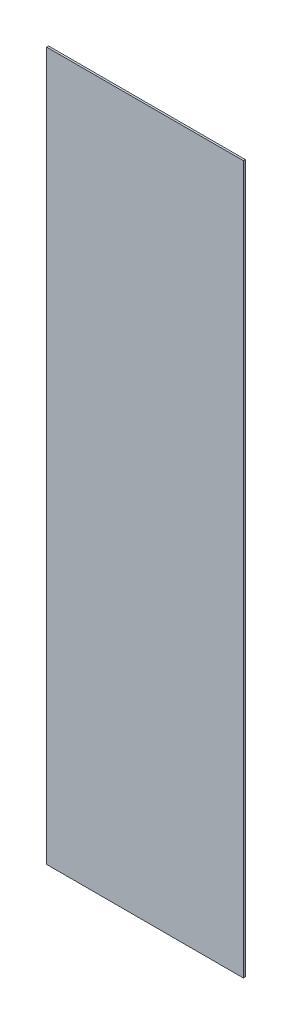
ISO-10303-21;
HEADER;
FILE_DESCRIPTION(('STEP AP214'),'2;1');
FILE_NAME('part.step','',(''),(''),'','','');
FILE_SCHEMA(('AUTOMOTIVE_DESIGN { 1 0 10303 214 1 1 1 1 }'));
ENDSEC;
DATA;
#1=APPLICATION_CONTEXT('core data for automotive mechanical design processes');
#2=APPLICATION_PROTOCOL_DEFINITION('international standard','automotive_design',2000,#1);
#3=PRODUCT_CONTEXT('',#1,'mechanical');
#4=PRODUCT('Part','Part','',(#3));
#5=PRODUCT_RELATED_PRODUCT_CATEGORY('part','',(#4));
#6=PRODUCT_DEFINITION_FORMATION('','',#4);
#7=PRODUCT_DEFINITION_CONTEXT('part definition',#1,'design');
#8=PRODUCT_DEFINITION('design','',#6,#7);
#9=PRODUCT_DEFINITION_SHAPE('','',#8);
#10=(LENGTH_UNIT() NAMED_UNIT(*) SI_UNIT(.MILLI.,.METRE.));
#11=(NAMED_UNIT(*) PLANE_ANGLE_UNIT() SI_UNIT($,.RADIAN.));
#12=(NAMED_UNIT(*) SI_UNIT($,.STERADIAN.) SOLID_ANGLE_UNIT());
#13=UNCERTAINTY_MEASURE_WITH_UNIT(LENGTH_MEASURE(1.E-05),#10,'distance_accuracy_value','');
#14=(GEOMETRIC_REPRESENTATION_CONTEXT(3) GLOBAL_UNCERTAINTY_ASSIGNED_CONTEXT((#13)) GLOBAL_UNIT_ASSIGNED_CONTEXT((#10,
#11,#12)) REPRESENTATION_CONTEXT('',''));
#15=CARTESIAN_POINT('',(0.,0.,0.));
#16=DIRECTION('',(0.,0.,1.));
#17=DIRECTION('',(1.,0.,0.));
#18=AXIS2_PLACEMENT_3D('',#15,#16,#17);
#19=CARTESIAN_POINT('',(0.,0.,2.54));
#20=DIRECTION('',(1.,0.,0.));
#21=DIRECTION('',(0.,0.,-1.));
#22=AXIS2_PLACEMENT_3D('',#19,#20,#21);
#23=PLANE('',#22);
#24=DIRECTION('',(0.,-1.,0.));
#25=VECTOR('',#24,1.);
#26=CARTESIAN_POINT('',(0.,0.,0.));
#27=LINE('',#26,#25);
#28=CARTESIAN_POINT('',(0.,914.4,0.));
#29=VERTEX_POINT('',#28);
#30=CARTESIAN_POINT('',(0.,0.,0.));
#31=VERTEX_POINT('',#30);
#32=EDGE_CURVE('E96',#29,#31,#27,.T.);
#33=ORIENTED_EDGE('',*,*,#32,.T.);
#34=DIRECTION('',(0.,0.,-1.));
#35=VECTOR('',#34,1.);
#36=CARTESIAN_POINT('',(0.,0.,2.54));
#37=LINE('',#36,#35);
#38=CARTESIAN_POINT('',(0.,0.,2.54));
#39=VERTEX_POINT('',#38);
#40=EDGE_CURVE('E11',#39,#31,#37,.T.);
#41=ORIENTED_EDGE('',*,*,#40,.F.);
#42=DIRECTION('',(0.,-1.,0.));
#43=VECTOR('',#42,1.);
#44=CARTESIAN_POINT('',(0.,0.,2.54));
#45=LINE('',#44,#43);
#46=CARTESIAN_POINT('',(0.,914.4,2.54));
#47=VERTEX_POINT('',#46);
#48=EDGE_CURVE('E84',#47,#39,#45,.T.);
#49=ORIENTED_EDGE('',*,*,#48,.F.);
#50=DIRECTION('',(0.,0.,-1.));
#51=VECTOR('',#50,1.);
#52=CARTESIAN_POINT('',(0.,914.4,2.54));
#53=LINE('',#52,#51);
#54=EDGE_CURVE('E92',#47,#29,#53,.T.);
#55=ORIENTED_EDGE('',*,*,#54,.T.);
#56=EDGE_LOOP('',(#33,#41,#49,#55));
#57=FACE_BOUND('',#56,.T.);
#58=ADVANCED_FACE('F33',(#57),#23,.F.);
#59=CARTESIAN_POINT('',(0.,0.,2.54));
#60=DIRECTION('',(0.,1.,0.));
#61=DIRECTION('',(0.,0.,1.));
#62=AXIS2_PLACEMENT_3D('',#59,#60,#61);
#63=PLANE('',#62);
#64=DIRECTION('',(1.,0.,0.));
#65=VECTOR('',#64,1.);
#66=CARTESIAN_POINT('',(0.,0.,0.));
#67=LINE('',#66,#65);
#68=CARTESIAN_POINT('',(254.,0.,0.));
#69=VERTEX_POINT('',#68);
#70=EDGE_CURVE('E88',#31,#69,#67,.T.);
#71=ORIENTED_EDGE('',*,*,#70,.T.);
#72=DIRECTION('',(0.,0.,-1.));
#73=VECTOR('',#72,1.);
#74=CARTESIAN_POINT('',(254.,0.,2.54));
#75=LINE('',#74,#73);
#76=CARTESIAN_POINT('',(254.,0.,2.54));
#77=VERTEX_POINT('',#76);
#78=EDGE_CURVE('E41',#77,#69,#75,.T.);
#79=ORIENTED_EDGE('',*,*,#78,.F.);
#80=DIRECTION('',(1.,0.,0.));
#81=VECTOR('',#80,1.);
#82=CARTESIAN_POINT('',(0.,0.,2.54));
#83=LINE('',#82,#81);
#84=EDGE_CURVE('E79',#39,#77,#83,.T.);
#85=ORIENTED_EDGE('',*,*,#84,.F.);
#86=ORIENTED_EDGE('',*,*,#40,.T.);
#87=EDGE_LOOP('',(#71,#79,#85,#86));
#88=FACE_BOUND('',#87,.T.);
#89=ADVANCED_FACE('F87',(#88),#63,.F.);
#90=CARTESIAN_POINT('',(254.,0.,2.54));
#91=DIRECTION('',(-1.,0.,0.));
#92=DIRECTION('',(0.,0.,1.));
#93=AXIS2_PLACEMENT_3D('',#90,#91,#92);
#94=PLANE('',#93);
#95=DIRECTION('',(0.,1.,0.));
#96=VECTOR('',#95,1.);
#97=CARTESIAN_POINT('',(254.,0.,0.));
#98=LINE('',#97,#96);
#99=CARTESIAN_POINT('',(254.,914.4,0.));
#100=VERTEX_POINT('',#99);
#101=EDGE_CURVE('E66',#69,#100,#98,.T.);
#102=ORIENTED_EDGE('',*,*,#101,.T.);
#103=DIRECTION('',(0.,0.,-1.));
#104=VECTOR('',#103,1.);
#105=CARTESIAN_POINT('',(254.,914.4,2.54));
#106=LINE('',#105,#104);
#107=CARTESIAN_POINT('',(254.,914.4,2.54));
#108=VERTEX_POINT('',#107);
#109=EDGE_CURVE('E89',#108,#100,#106,.T.);
#110=ORIENTED_EDGE('',*,*,#109,.F.);
#111=DIRECTION('',(0.,1.,0.));
#112=VECTOR('',#111,1.);
#113=CARTESIAN_POINT('',(254.,0.,2.54));
#114=LINE('',#113,#112);
#115=EDGE_CURVE('E82',#77,#108,#114,.T.);
#116=ORIENTED_EDGE('',*,*,#115,.F.);
#117=ORIENTED_EDGE('',*,*,#78,.T.);
#118=EDGE_LOOP('',(#102,#110,#116,#117));
#119=FACE_BOUND('',#118,.T.);
#120=ADVANCED_FACE('F90',(#119),#94,.F.);
#121=CARTESIAN_POINT('',(0.,914.4,2.54));
#122=DIRECTION('',(0.,-1.,0.));
#123=DIRECTION('',(0.,0.,-1.));
#124=AXIS2_PLACEMENT_3D('',#121,#122,#123);
#125=PLANE('',#124);
#126=DIRECTION('',(-1.,0.,0.));
#127=VECTOR('',#126,1.);
#128=CARTESIAN_POINT('',(0.,914.4,0.));
#129=LINE('',#128,#127);
#130=EDGE_CURVE('E72',#100,#29,#129,.T.);
#131=ORIENTED_EDGE('',*,*,#130,.T.);
#132=ORIENTED_EDGE('',*,*,#54,.F.);
#133=DIRECTION('',(-1.,0.,0.));
#134=VECTOR('',#133,1.);
#135=CARTESIAN_POINT('',(0.,914.4,2.54));
#136=LINE('',#135,#134);
#137=EDGE_CURVE('E49',#108,#47,#136,.T.);
#138=ORIENTED_EDGE('',*,*,#137,.F.);
#139=ORIENTED_EDGE('',*,*,#109,.T.);
#140=EDGE_LOOP('',(#131,#132,#138,#139));
#141=FACE_BOUND('',#140,.T.);
#142=ADVANCED_FACE('F103',(#141),#125,.F.);
#143=CARTESIAN_POINT('',(0.,0.,2.54));
#144=DIRECTION('',(0.,0.,-1.));
#145=DIRECTION('',(-1.,0.,0.));
#146=AXIS2_PLACEMENT_3D('',#143,#144,#145);
#147=PLANE('',#146);
#148=ORIENTED_EDGE('',*,*,#48,.T.);
#149=ORIENTED_EDGE('',*,*,#84,.T.);
#150=ORIENTED_EDGE('',*,*,#115,.T.);
#151=ORIENTED_EDGE('',*,*,#137,.T.);
#152=EDGE_LOOP('',(#148,#149,#150,#151));
#153=FACE_BOUND('',#152,.T.);
#154=ADVANCED_FACE('F80',(#153),#147,.F.);
#155=CARTESIAN_POINT('',(0.,0.,0.));
#156=DIRECTION('',(0.,0.,-1.));
#157=DIRECTION('',(-1.,0.,0.));
#158=AXIS2_PLACEMENT_3D('',#155,#156,#157);
#159=PLANE('',#158);
#160=ORIENTED_EDGE('',*,*,#32,.F.);
#161=ORIENTED_EDGE('',*,*,#130,.F.);
#162=ORIENTED_EDGE('',*,*,#101,.F.);
#163=ORIENTED_EDGE('',*,*,#70,.F.);
#164=EDGE_LOOP('',(#160,#161,#162,#163));
#165=FACE_BOUND('',#164,.T.);
#166=ADVANCED_FACE('F106',(#165),#159,.T.);
#167=CLOSED_SHELL('',(#58,#89,#120,#142,#154,#166));
#168=MANIFOLD_SOLID_BREP('B2',#167);
#169=ADVANCED_BREP_SHAPE_REPRESENTATION('',(#18,#168),#14);
#170=SHAPE_DEFINITION_REPRESENTATION(#9,#169);
ENDSEC;
END-ISO-10303-21;
